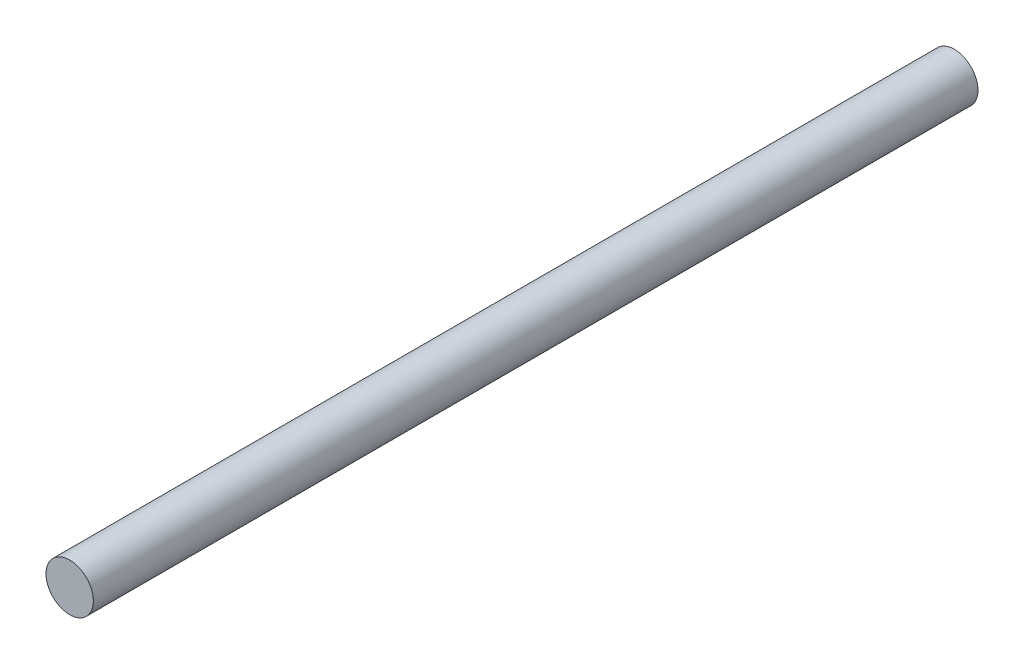
ISO-10303-21;
HEADER;
FILE_DESCRIPTION(('STEP AP214'),'2;1');
FILE_NAME('part.step','',(''),(''),'','','');
FILE_SCHEMA(('AUTOMOTIVE_DESIGN { 1 0 10303 214 1 1 1 1 }'));
ENDSEC;
DATA;
#1=APPLICATION_CONTEXT('core data for automotive mechanical design processes');
#2=APPLICATION_PROTOCOL_DEFINITION('international standard','automotive_design',2000,#1);
#3=PRODUCT_CONTEXT('',#1,'mechanical');
#4=PRODUCT('Part','Part','',(#3));
#5=PRODUCT_RELATED_PRODUCT_CATEGORY('part','',(#4));
#6=PRODUCT_DEFINITION_FORMATION('','',#4);
#7=PRODUCT_DEFINITION_CONTEXT('part definition',#1,'design');
#8=PRODUCT_DEFINITION('design','',#6,#7);
#9=PRODUCT_DEFINITION_SHAPE('','',#8);
#10=(LENGTH_UNIT() NAMED_UNIT(*) SI_UNIT(.MILLI.,.METRE.));
#11=(NAMED_UNIT(*) PLANE_ANGLE_UNIT() SI_UNIT($,.RADIAN.));
#12=(NAMED_UNIT(*) SI_UNIT($,.STERADIAN.) SOLID_ANGLE_UNIT());
#13=UNCERTAINTY_MEASURE_WITH_UNIT(LENGTH_MEASURE(1.E-05),#10,'distance_accuracy_value','');
#14=(GEOMETRIC_REPRESENTATION_CONTEXT(3) GLOBAL_UNCERTAINTY_ASSIGNED_CONTEXT((#13)) GLOBAL_UNIT_ASSIGNED_CONTEXT((#10,
#11,#12)) REPRESENTATION_CONTEXT('',''));
#15=CARTESIAN_POINT('',(0.,0.,0.));
#16=DIRECTION('',(0.,0.,1.));
#17=DIRECTION('',(1.,0.,0.));
#18=AXIS2_PLACEMENT_3D('',#15,#16,#17);
#19=CARTESIAN_POINT('',(0.,0.,355.6));
#20=DIRECTION('',(0.,0.,-1.));
#21=DIRECTION('',(-1.,0.,0.));
#22=AXIS2_PLACEMENT_3D('',#19,#20,#21);
#23=CYLINDRICAL_SURFACE('',#22,9.525);
#24=CARTESIAN_POINT('',(0.,0.,355.6));
#25=DIRECTION('',(0.,0.,1.));
#26=DIRECTION('',(1.,0.,0.));
#27=AXIS2_PLACEMENT_3D('',#24,#25,#26);
#28=CIRCLE('',#27,9.525);
#29=CARTESIAN_POINT('',(9.525,0.,355.6));
#30=VERTEX_POINT('',#29);
#31=EDGE_CURVE('E10',#30,#30,#28,.T.);
#32=ORIENTED_EDGE('',*,*,#31,.F.);
#33=EDGE_LOOP('',(#32));
#34=FACE_BOUND('',#33,.T.);
#35=CARTESIAN_POINT('',(0.,0.,0.));
#36=DIRECTION('',(0.,0.,1.));
#37=DIRECTION('',(1.,0.,0.));
#38=AXIS2_PLACEMENT_3D('',#35,#36,#37);
#39=CIRCLE('',#38,9.525);
#40=CARTESIAN_POINT('',(9.525,0.,0.));
#41=VERTEX_POINT('',#40);
#42=EDGE_CURVE('E34',#41,#41,#39,.T.);
#43=ORIENTED_EDGE('',*,*,#42,.T.);
#44=EDGE_LOOP('',(#43));
#45=FACE_BOUND('',#44,.T.);
#46=ADVANCED_FACE('F31',(#34,#45),#23,.T.);
#47=CARTESIAN_POINT('',(0.,0.,355.6));
#48=DIRECTION('',(0.,0.,1.));
#49=DIRECTION('',(1.,0.,0.));
#50=AXIS2_PLACEMENT_3D('',#47,#48,#49);
#51=PLANE('',#50);
#52=ORIENTED_EDGE('',*,*,#31,.T.);
#53=EDGE_LOOP('',(#52));
#54=FACE_BOUND('',#53,.T.);
#55=ADVANCED_FACE('F46',(#54),#51,.T.);
#56=CARTESIAN_POINT('',(0.,0.,0.));
#57=DIRECTION('',(0.,0.,1.));
#58=DIRECTION('',(1.,0.,0.));
#59=AXIS2_PLACEMENT_3D('',#56,#57,#58);
#60=PLANE('',#59);
#61=ORIENTED_EDGE('',*,*,#42,.F.);
#62=EDGE_LOOP('',(#61));
#63=FACE_BOUND('',#62,.T.);
#64=ADVANCED_FACE('F44',(#63),#60,.F.);
#65=CLOSED_SHELL('',(#46,#55,#64));
#66=MANIFOLD_SOLID_BREP('B2',#65);
#67=ADVANCED_BREP_SHAPE_REPRESENTATION('',(#18,#66),#14);
#68=SHAPE_DEFINITION_REPRESENTATION(#9,#67);
ENDSEC;
END-ISO-10303-21;
